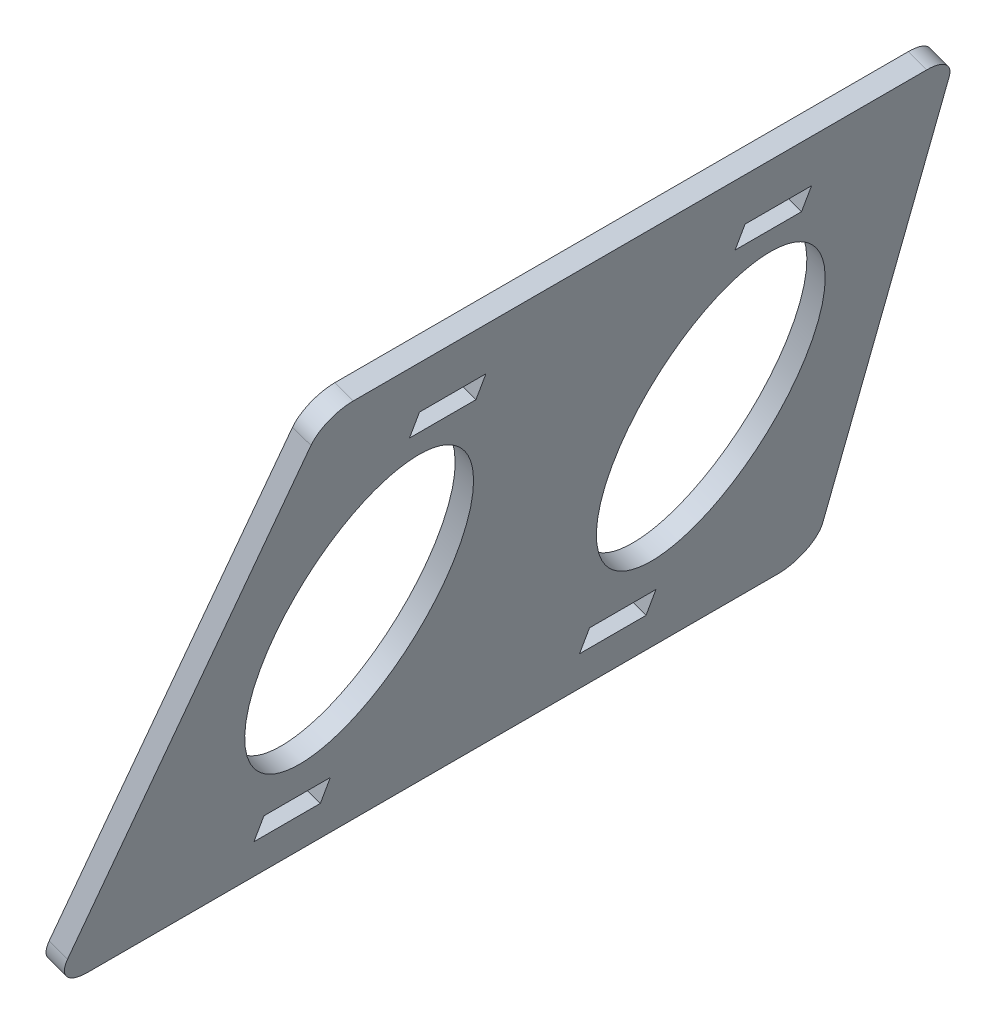
ISO-10303-21;
HEADER;
FILE_DESCRIPTION(('STEP AP214'),'2;1');
FILE_NAME('part.step','',(''),(''),'','','');
FILE_SCHEMA(('AUTOMOTIVE_DESIGN { 1 0 10303 214 1 1 1 1 }'));
ENDSEC;
DATA;
#1=APPLICATION_CONTEXT('core data for automotive mechanical design processes');
#2=APPLICATION_PROTOCOL_DEFINITION('international standard','automotive_design',2000,#1);
#3=PRODUCT_CONTEXT('',#1,'mechanical');
#4=PRODUCT('Part','Part','',(#3));
#5=PRODUCT_RELATED_PRODUCT_CATEGORY('part','',(#4));
#6=PRODUCT_DEFINITION_FORMATION('','',#4);
#7=PRODUCT_DEFINITION_CONTEXT('part definition',#1,'design');
#8=PRODUCT_DEFINITION('design','',#6,#7);
#9=PRODUCT_DEFINITION_SHAPE('','',#8);
#10=(LENGTH_UNIT() NAMED_UNIT(*) SI_UNIT(.MILLI.,.METRE.));
#11=(NAMED_UNIT(*) PLANE_ANGLE_UNIT() SI_UNIT($,.RADIAN.));
#12=(NAMED_UNIT(*) SI_UNIT($,.STERADIAN.) SOLID_ANGLE_UNIT());
#13=UNCERTAINTY_MEASURE_WITH_UNIT(LENGTH_MEASURE(1.E-05),#10,'distance_accuracy_value','');
#14=(GEOMETRIC_REPRESENTATION_CONTEXT(3) GLOBAL_UNCERTAINTY_ASSIGNED_CONTEXT((#13)) GLOBAL_UNIT_ASSIGNED_CONTEXT((#10,
#11,#12)) REPRESENTATION_CONTEXT('',''));
#15=CARTESIAN_POINT('',(0.,0.,0.));
#16=DIRECTION('',(0.,0.,1.));
#17=DIRECTION('',(1.,0.,0.));
#18=AXIS2_PLACEMENT_3D('',#15,#16,#17);
#19=CARTESIAN_POINT('',(-40.2709018610442,206.838861365217,-44.0289294402157));
#20=DIRECTION('',(-0.93969262078591,0.342020143325665,0.));
#21=DIRECTION('',(-0.342020143325665,-0.93969262078591,0.));
#22=AXIS2_PLACEMENT_3D('',#19,#20,#21);
#23=CYLINDRICAL_SURFACE('',#22,5.);
#24=CARTESIAN_POINT('',(-68.3692794960448,217.065834455528,-44.0289294402157));
#25=DIRECTION('',(-0.939692620785913,0.342020143325656,0.));
#26=DIRECTION('',(-0.342020143325656,-0.939692620785913,0.));
#27=AXIS2_PLACEMENT_3D('',#24,#25,#26);
#28=CIRCLE('',#27,5.);
#29=CARTESIAN_POINT('',(-68.1855865013136,217.570526810664,-49.));
#30=VERTEX_POINT('',#29);
#31=CARTESIAN_POINT('',(-66.6591787794165,221.764297559458,-44.0289294402157));
#32=VERTEX_POINT('',#31);
#33=EDGE_CURVE('E320',#30,#32,#28,.F.);
#34=ORIENTED_EDGE('',*,*,#33,.F.);
#35=DIRECTION('',(-0.93969262078591,0.342020143325665,0.));
#36=VECTOR('',#35,1.);
#37=CARTESIAN_POINT('',(-40.087208866313,207.343553720353,-49.));
#38=LINE('',#37,#36);
#39=CARTESIAN_POINT('',(-71.0046643636713,218.596587240641,-49.));
#40=VERTEX_POINT('',#39);
#41=EDGE_CURVE('E364',#30,#40,#38,.T.);
#42=ORIENTED_EDGE('',*,*,#41,.T.);
#43=CARTESIAN_POINT('',(-71.1883573584025,218.091894885505,-44.0289294402157));
#44=DIRECTION('',(-0.93969262078591,0.342020143325665,0.));
#45=DIRECTION('',(-0.342020143325665,-0.93969262078591,0.));
#46=AXIS2_PLACEMENT_3D('',#43,#44,#45);
#47=CIRCLE('',#46,5.);
#48=CARTESIAN_POINT('',(-69.4782566417742,222.790357989435,-44.0289294402157));
#49=VERTEX_POINT('',#48);
#50=EDGE_CURVE('E337',#49,#40,#47,.T.);
#51=ORIENTED_EDGE('',*,*,#50,.F.);
#52=DIRECTION('',(-0.93969262078591,0.342020143325665,0.));
#53=VECTOR('',#52,1.);
#54=CARTESIAN_POINT('',(-38.5608011444158,211.537324469147,-44.0289294402157));
#55=LINE('',#54,#53);
#56=EDGE_CURVE('E367',#32,#49,#55,.T.);
#57=ORIENTED_EDGE('',*,*,#56,.F.);
#58=EDGE_LOOP('',(#34,#42,#51,#57));
#59=FACE_BOUND('',#58,.T.);
#60=ADVANCED_FACE('F31',(#59),#23,.T.);
#61=CARTESIAN_POINT('',(-40.087208866313,207.343553720353,-49.));
#62=DIRECTION('',(0.0367385989462375,0.100938471027188,-0.994214111956857));
#63=DIRECTION('',(0.,0.994885749576172,0.101006659633206));
#64=AXIS2_PLACEMENT_3D('',#61,#62,#63);
#65=PLANE('',#64);
#66=DIRECTION('',(0.340041253067873,0.934255664487078,0.107416477254837));
#67=VECTOR('',#66,1.);
#68=CARTESIAN_POINT('',(-68.1855865013137,217.570526810664,-49.));
#69=LINE('',#68,#67);
#70=CARTESIAN_POINT('',(-96.584712524337,139.544569330158,-57.9710705597843));
#71=VERTEX_POINT('',#70);
#72=EDGE_CURVE('E322',#71,#30,#69,.T.);
#73=ORIENTED_EDGE('',*,*,#72,.F.);
#74=DIRECTION('',(-0.93969262078591,0.342020143325665,0.));
#75=VECTOR('',#74,1.);
#76=CARTESIAN_POINT('',(-68.4863348893373,129.317596239847,-57.9710705597843));
#77=LINE('',#76,#75);
#78=CARTESIAN_POINT('',(-99.4037903866956,140.570629760135,-57.9710705597843));
#79=VERTEX_POINT('',#78);
#80=EDGE_CURVE('E361',#71,#79,#77,.T.);
#81=ORIENTED_EDGE('',*,*,#80,.T.);
#82=DIRECTION('',(-0.340041253067883,-0.934255664487074,-0.107416477254837));
#83=VECTOR('',#82,1.);
#84=CARTESIAN_POINT('',(-71.0046643636713,218.596587240641,-49.));
#85=LINE('',#84,#83);
#86=EDGE_CURVE('E339',#40,#79,#85,.T.);
#87=ORIENTED_EDGE('',*,*,#86,.F.);
#88=ORIENTED_EDGE('',*,*,#41,.F.);
#89=EDGE_LOOP('',(#73,#81,#87,#88));
#90=FACE_BOUND('',#89,.T.);
#91=ADVANCED_FACE('F389',(#90),#65,.T.);
#92=CARTESIAN_POINT('',(-68.6700278840684,128.812903884711,-53.));
#93=DIRECTION('',(-0.93969262078591,0.342020143325665,0.));
#94=DIRECTION('',(-0.342020143325665,-0.93969262078591,0.));
#95=AXIS2_PLACEMENT_3D('',#92,#93,#94);
#96=CYLINDRICAL_SURFACE('',#95,5.);
#97=ORIENTED_EDGE('',*,*,#80,.F.);
#98=CARTESIAN_POINT('',(-96.7684055190682,139.039876975022,-53.));
#99=DIRECTION('',(-0.939692620785913,0.342020143325656,0.));
#100=DIRECTION('',(-0.342020143325656,-0.939692620785913,0.));
#101=AXIS2_PLACEMENT_3D('',#98,#99,#100);
#102=CIRCLE('',#101,5.);
#103=CARTESIAN_POINT('',(-98.4785062356965,134.341413871092,-53.));
#104=VERTEX_POINT('',#103);
#105=EDGE_CURVE('E324',#104,#71,#102,.F.);
#106=ORIENTED_EDGE('',*,*,#105,.F.);
#107=DIRECTION('',(-0.93969262078591,0.342020143325665,0.));
#108=VECTOR('',#107,1.);
#109=CARTESIAN_POINT('',(-70.3801286006968,124.114440780781,-53.));
#110=LINE('',#109,#108);
#111=CARTESIAN_POINT('',(-101.297584098055,135.36747430107,-53.));
#112=VERTEX_POINT('',#111);
#113=EDGE_CURVE('E358',#104,#112,#110,.T.);
#114=ORIENTED_EDGE('',*,*,#113,.T.);
#115=CARTESIAN_POINT('',(-99.5874833814268,140.065937404999,-53.));
#116=DIRECTION('',(-0.93969262078591,0.342020143325665,0.));
#117=DIRECTION('',(-0.342020143325665,-0.93969262078591,0.));
#118=AXIS2_PLACEMENT_3D('',#115,#116,#117);
#119=CIRCLE('',#118,5.);
#120=EDGE_CURVE('E341',#79,#112,#119,.T.);
#121=ORIENTED_EDGE('',*,*,#120,.F.);
#122=EDGE_LOOP('',(#97,#106,#114,#121));
#123=FACE_BOUND('',#122,.T.);
#124=ADVANCED_FACE('F399',(#123),#96,.T.);
#125=CARTESIAN_POINT('',(-66.6591787794165,221.764297559458,58.));
#126=DIRECTION('',(-0.342020143325658,-0.939692620785912,0.));
#127=DIRECTION('',(0.939692620785912,-0.342020143325658,0.));
#128=AXIS2_PLACEMENT_3D('',#125,#126,#127);
#129=PLANE('',#128);
#130=DIRECTION('',(-0.93969262078591,0.342020143325665,0.));
#131=VECTOR('',#130,1.);
#132=CARTESIAN_POINT('',(-38.5608011444158,211.537324469147,44.0289294402157));
#133=LINE('',#132,#131);
#134=CARTESIAN_POINT('',(-66.6591787794165,221.764297559458,44.0289294402157));
#135=VERTEX_POINT('',#134);
#136=CARTESIAN_POINT('',(-69.4782566417742,222.790357989435,44.0289294402157));
#137=VERTEX_POINT('',#136);
#138=EDGE_CURVE('E348',#135,#137,#133,.T.);
#139=ORIENTED_EDGE('',*,*,#138,.F.);
#140=DIRECTION('',(0.,0.,-1.));
#141=VECTOR('',#140,1.);
#142=CARTESIAN_POINT('',(-66.6591787794165,221.764297559458,58.));
#143=LINE('',#142,#141);
#144=EDGE_CURVE('E11',#135,#32,#143,.T.);
#145=ORIENTED_EDGE('',*,*,#144,.T.);
#146=ORIENTED_EDGE('',*,*,#56,.T.);
#147=DIRECTION('',(0.,0.,-1.));
#148=VECTOR('',#147,1.);
#149=CARTESIAN_POINT('',(-69.4782566417742,222.790357989435,58.));
#150=LINE('',#149,#148);
#151=EDGE_CURVE('E39',#137,#49,#150,.T.);
#152=ORIENTED_EDGE('',*,*,#151,.F.);
#153=EDGE_LOOP('',(#139,#145,#146,#152));
#154=FACE_BOUND('',#153,.T.);
#155=ADVANCED_FACE('F411',(#154),#129,.F.);
#156=CARTESIAN_POINT('',(-98.4785062356965,134.341413871092,58.));
#157=DIRECTION('',(0.342020143325656,0.939692620785913,0.));
#158=DIRECTION('',(-0.939692620785913,0.342020143325656,0.));
#159=AXIS2_PLACEMENT_3D('',#156,#157,#158);
#160=PLANE('',#159);
#161=DIRECTION('',(0.,0.,-1.));
#162=VECTOR('',#161,1.);
#163=CARTESIAN_POINT('',(-98.4785062356965,134.341413871092,58.));
#164=LINE('',#163,#162);
#165=CARTESIAN_POINT('',(-98.4785062356965,134.341413871092,53.));
#166=VERTEX_POINT('',#165);
#167=EDGE_CURVE('E351',#166,#104,#164,.T.);
#168=ORIENTED_EDGE('',*,*,#167,.F.);
#169=DIRECTION('',(-0.93969262078591,0.342020143325665,0.));
#170=VECTOR('',#169,1.);
#171=CARTESIAN_POINT('',(-70.3801286006968,124.114440780781,53.));
#172=LINE('',#171,#170);
#173=CARTESIAN_POINT('',(-101.297584098055,135.367474301069,53.));
#174=VERTEX_POINT('',#173);
#175=EDGE_CURVE('E355',#166,#174,#172,.T.);
#176=ORIENTED_EDGE('',*,*,#175,.T.);
#177=DIRECTION('',(0.,0.,-1.));
#178=VECTOR('',#177,1.);
#179=CARTESIAN_POINT('',(-101.297584098055,135.367474301069,58.));
#180=LINE('',#179,#178);
#181=EDGE_CURVE('E372',#174,#112,#180,.T.);
#182=ORIENTED_EDGE('',*,*,#181,.T.);
#183=ORIENTED_EDGE('',*,*,#113,.F.);
#184=EDGE_LOOP('',(#168,#176,#182,#183));
#185=FACE_BOUND('',#184,.T.);
#186=ADVANCED_FACE('F396',(#185),#160,.F.);
#187=CARTESIAN_POINT('',(-66.6591787794165,221.764297559458,58.));
#188=DIRECTION('',(-0.939692620785913,0.342020143325656,0.));
#189=DIRECTION('',(-0.342020143325656,-0.939692620785913,0.));
#190=AXIS2_PLACEMENT_3D('',#187,#188,#189);
#191=PLANE('',#190);
#192=CARTESIAN_POINT('',(-82.7870055468363,177.453457691096,27.));
#193=DIRECTION('',(-0.93969262078591,0.342020143325665,0.));
#194=DIRECTION('',(-0.342020143325665,-0.93969262078591,0.));
#195=AXIS2_PLACEMENT_3D('',#192,#193,#194);
#196=ELLIPSE('',#195,26.7782561446256,15.);
#197=CARTESIAN_POINT('',(-91.9457085514325,152.290127994476,27.));
#198=VERTEX_POINT('',#197);
#199=EDGE_CURVE('E662',#198,#198,#196,.F.);
#200=ORIENTED_EDGE('',*,*,#199,.F.);
#201=EDGE_LOOP('',(#200));
#202=FACE_BOUND('',#201,.T.);
#203=CARTESIAN_POINT('',(-82.7870055468363,177.453457691096,-27.));
#204=DIRECTION('',(-0.93969262078591,0.342020143325665,0.));
#205=DIRECTION('',(-0.342020143325665,-0.93969262078591,0.));
#206=AXIS2_PLACEMENT_3D('',#203,#204,#205);
#207=ELLIPSE('',#206,26.7782561446256,15.);
#208=CARTESIAN_POINT('',(-91.9457085514325,152.290127994476,-27.));
#209=VERTEX_POINT('',#208);
#210=EDGE_CURVE('E667',#209,#209,#207,.F.);
#211=ORIENTED_EDGE('',*,*,#210,.F.);
#212=EDGE_LOOP('',(#211));
#213=FACE_BOUND('',#212,.T.);
#214=DIRECTION('',(-0.342020143325656,-0.939692620785913,0.));
#215=VECTOR('',#214,1.);
#216=CARTESIAN_POINT('',(-94.3056475403789,145.806248911053,30.1));
#217=LINE('',#216,#215);
#218=CARTESIAN_POINT('',(-94.3056475403788,145.806248911053,30.1));
#219=VERTEX_POINT('',#218);
#220=CARTESIAN_POINT('',(-95.8394177269125,141.592249956919,30.1));
#221=VERTEX_POINT('',#220);
#222=EDGE_CURVE('E211',#219,#221,#217,.T.);
#223=ORIENTED_EDGE('',*,*,#222,.F.);
#224=DIRECTION('',(0.,0.,1.));
#225=VECTOR('',#224,1.);
#226=CARTESIAN_POINT('',(-94.3056475403788,145.806248911053,30.1));
#227=LINE('',#226,#225);
#228=CARTESIAN_POINT('',(-94.3056475403788,145.806248911053,19.9));
#229=VERTEX_POINT('',#228);
#230=EDGE_CURVE('E194',#229,#219,#227,.T.);
#231=ORIENTED_EDGE('',*,*,#230,.F.);
#232=DIRECTION('',(0.342020143325656,0.939692620785913,0.));
#233=VECTOR('',#232,1.);
#234=CARTESIAN_POINT('',(-94.3056475403789,145.806248911053,19.9));
#235=LINE('',#234,#233);
#236=CARTESIAN_POINT('',(-95.8394177269125,141.592249956919,19.9));
#237=VERTEX_POINT('',#236);
#238=EDGE_CURVE('E203',#237,#229,#235,.T.);
#239=ORIENTED_EDGE('',*,*,#238,.F.);
#240=DIRECTION('',(0.,0.,-1.));
#241=VECTOR('',#240,1.);
#242=CARTESIAN_POINT('',(-95.8394177269125,141.592249956919,30.1));
#243=LINE('',#242,#241);
#244=EDGE_CURVE('E46',#221,#237,#243,.T.);
#245=ORIENTED_EDGE('',*,*,#244,.F.);
#246=EDGE_LOOP('',(#223,#231,#239,#245));
#247=FACE_BOUND('',#246,.T.);
#248=DIRECTION('',(-0.342020143325656,-0.939692620785913,0.));
#249=VECTOR('',#248,1.);
#250=CARTESIAN_POINT('',(-70.4186336534106,211.4352801837,30.1));
#251=LINE('',#250,#249);
#252=CARTESIAN_POINT('',(-70.4186336534105,211.4352801837,30.1));
#253=VERTEX_POINT('',#252);
#254=CARTESIAN_POINT('',(-71.9524038399441,207.221281229566,30.1));
#255=VERTEX_POINT('',#254);
#256=EDGE_CURVE('E229',#253,#255,#251,.T.);
#257=ORIENTED_EDGE('',*,*,#256,.F.);
#258=DIRECTION('',(0.,0.,1.));
#259=VECTOR('',#258,1.);
#260=CARTESIAN_POINT('',(-70.4186336534105,211.4352801837,30.1));
#261=LINE('',#260,#259);
#262=CARTESIAN_POINT('',(-70.4186336534105,211.4352801837,19.9));
#263=VERTEX_POINT('',#262);
#264=EDGE_CURVE('E232',#263,#253,#261,.T.);
#265=ORIENTED_EDGE('',*,*,#264,.F.);
#266=DIRECTION('',(0.342020143325656,0.939692620785913,0.));
#267=VECTOR('',#266,1.);
#268=CARTESIAN_POINT('',(-70.4186336534106,211.4352801837,19.9));
#269=LINE('',#268,#267);
#270=CARTESIAN_POINT('',(-71.9524038399442,207.221281229566,19.9));
#271=VERTEX_POINT('',#270);
#272=EDGE_CURVE('E249',#271,#263,#269,.T.);
#273=ORIENTED_EDGE('',*,*,#272,.F.);
#274=DIRECTION('',(0.,0.,-1.));
#275=VECTOR('',#274,1.);
#276=CARTESIAN_POINT('',(-71.9524038399442,207.221281229566,30.1));
#277=LINE('',#276,#275);
#278=EDGE_CURVE('E206',#255,#271,#277,.T.);
#279=ORIENTED_EDGE('',*,*,#278,.F.);
#280=EDGE_LOOP('',(#257,#265,#273,#279));
#281=FACE_BOUND('',#280,.T.);
#282=DIRECTION('',(0.,0.,1.));
#283=VECTOR('',#282,1.);
#284=CARTESIAN_POINT('',(-94.3056475403788,145.806248911053,-30.1));
#285=LINE('',#284,#283);
#286=CARTESIAN_POINT('',(-94.3056475403788,145.806248911053,-30.1));
#287=VERTEX_POINT('',#286);
#288=CARTESIAN_POINT('',(-94.3056475403788,145.806248911053,-19.9));
#289=VERTEX_POINT('',#288);
#290=EDGE_CURVE('E260',#287,#289,#285,.T.);
#291=ORIENTED_EDGE('',*,*,#290,.F.);
#292=DIRECTION('',(0.342020143325656,0.939692620785913,0.));
#293=VECTOR('',#292,1.);
#294=CARTESIAN_POINT('',(-94.3056475403789,145.806248911053,-30.1));
#295=LINE('',#294,#293);
#296=CARTESIAN_POINT('',(-95.8394177269125,141.592249956919,-30.1));
#297=VERTEX_POINT('',#296);
#298=EDGE_CURVE('E263',#297,#287,#295,.T.);
#299=ORIENTED_EDGE('',*,*,#298,.F.);
#300=DIRECTION('',(0.,0.,-1.));
#301=VECTOR('',#300,1.);
#302=CARTESIAN_POINT('',(-95.8394177269125,141.592249956919,-30.1));
#303=LINE('',#302,#301);
#304=CARTESIAN_POINT('',(-95.8394177269125,141.592249956919,-19.9));
#305=VERTEX_POINT('',#304);
#306=EDGE_CURVE('E280',#305,#297,#303,.T.);
#307=ORIENTED_EDGE('',*,*,#306,.F.);
#308=DIRECTION('',(-0.342020143325656,-0.939692620785913,0.));
#309=VECTOR('',#308,1.);
#310=CARTESIAN_POINT('',(-94.3056475403789,145.806248911053,-19.9));
#311=LINE('',#310,#309);
#312=EDGE_CURVE('E258',#289,#305,#311,.T.);
#313=ORIENTED_EDGE('',*,*,#312,.F.);
#314=EDGE_LOOP('',(#291,#299,#307,#313));
#315=FACE_BOUND('',#314,.T.);
#316=DIRECTION('',(0.,0.,1.));
#317=VECTOR('',#316,1.);
#318=CARTESIAN_POINT('',(-70.4186336534105,211.4352801837,-30.1));
#319=LINE('',#318,#317);
#320=CARTESIAN_POINT('',(-70.4186336534105,211.4352801837,-30.1));
#321=VERTEX_POINT('',#320);
#322=CARTESIAN_POINT('',(-70.4186336534105,211.4352801837,-19.9));
#323=VERTEX_POINT('',#322);
#324=EDGE_CURVE('E291',#321,#323,#319,.T.);
#325=ORIENTED_EDGE('',*,*,#324,.F.);
#326=DIRECTION('',(0.342020143325656,0.939692620785913,0.));
#327=VECTOR('',#326,1.);
#328=CARTESIAN_POINT('',(-70.4186336534106,211.4352801837,-30.1));
#329=LINE('',#328,#327);
#330=CARTESIAN_POINT('',(-71.9524038399442,207.221281229566,-30.1));
#331=VERTEX_POINT('',#330);
#332=EDGE_CURVE('E294',#331,#321,#329,.T.);
#333=ORIENTED_EDGE('',*,*,#332,.F.);
#334=DIRECTION('',(0.,0.,-1.));
#335=VECTOR('',#334,1.);
#336=CARTESIAN_POINT('',(-71.9524038399442,207.221281229566,-30.1));
#337=LINE('',#336,#335);
#338=CARTESIAN_POINT('',(-71.9524038399441,207.221281229566,-19.9));
#339=VERTEX_POINT('',#338);
#340=EDGE_CURVE('E311',#339,#331,#337,.T.);
#341=ORIENTED_EDGE('',*,*,#340,.F.);
#342=DIRECTION('',(-0.342020143325656,-0.939692620785913,0.));
#343=VECTOR('',#342,1.);
#344=CARTESIAN_POINT('',(-70.4186336534106,211.4352801837,-19.9));
#345=LINE('',#344,#343);
#346=EDGE_CURVE('E289',#323,#339,#345,.T.);
#347=ORIENTED_EDGE('',*,*,#346,.F.);
#348=EDGE_LOOP('',(#325,#333,#341,#347));
#349=FACE_BOUND('',#348,.T.);
#350=CARTESIAN_POINT('',(-68.3692794960448,217.065834455528,44.0289294402157));
#351=DIRECTION('',(-0.939692620785913,0.342020143325656,0.));
#352=DIRECTION('',(-0.342020143325656,-0.939692620785913,0.));
#353=AXIS2_PLACEMENT_3D('',#350,#351,#352);
#354=CIRCLE('',#353,5.);
#355=CARTESIAN_POINT('',(-68.1855865013135,217.570526810664,49.));
#356=VERTEX_POINT('',#355);
#357=EDGE_CURVE('E331',#135,#356,#354,.F.);
#358=ORIENTED_EDGE('',*,*,#357,.T.);
#359=DIRECTION('',(-0.340041253067873,-0.934255664487078,0.107416477254837));
#360=VECTOR('',#359,1.);
#361=CARTESIAN_POINT('',(-96.5847125243371,139.544569330157,57.9710705597843));
#362=LINE('',#361,#360);
#363=CARTESIAN_POINT('',(-96.584712524337,139.544569330158,57.9710705597843));
#364=VERTEX_POINT('',#363);
#365=EDGE_CURVE('E328',#356,#364,#362,.T.);
#366=ORIENTED_EDGE('',*,*,#365,.T.);
#367=CARTESIAN_POINT('',(-96.7684055190682,139.039876975022,53.));
#368=DIRECTION('',(-0.939692620785913,0.342020143325656,0.));
#369=DIRECTION('',(-0.342020143325656,-0.939692620785913,0.));
#370=AXIS2_PLACEMENT_3D('',#367,#368,#369);
#371=CIRCLE('',#370,4.99999999999998);
#372=EDGE_CURVE('E326',#364,#166,#371,.F.);
#373=ORIENTED_EDGE('',*,*,#372,.T.);
#374=ORIENTED_EDGE('',*,*,#167,.T.);
#375=ORIENTED_EDGE('',*,*,#105,.T.);
#376=ORIENTED_EDGE('',*,*,#72,.T.);
#377=ORIENTED_EDGE('',*,*,#33,.T.);
#378=ORIENTED_EDGE('',*,*,#144,.F.);
#379=EDGE_LOOP('',(#358,#366,#373,#374,#375,#376,#377,#378));
#380=FACE_BOUND('',#379,.T.);
#381=ADVANCED_FACE('F33',(#202,#213,#247,#281,#315,#349,#380),#191,.F.);
#382=CARTESIAN_POINT('',(-69.4782566417742,222.790357989435,58.));
#383=DIRECTION('',(0.93969262078591,-0.342020143325665,0.));
#384=DIRECTION('',(0.342020143325665,0.93969262078591,0.));
#385=AXIS2_PLACEMENT_3D('',#382,#383,#384);
#386=PLANE('',#385);
#387=CARTESIAN_POINT('',(-85.606083409194,178.479518121073,27.));
#388=DIRECTION('',(-0.93969262078591,0.342020143325665,0.));
#389=DIRECTION('',(-0.342020143325665,-0.93969262078591,0.));
#390=AXIS2_PLACEMENT_3D('',#387,#388,#389);
#391=ELLIPSE('',#390,26.7782561446256,15.);
#392=CARTESIAN_POINT('',(-94.7647864137902,153.316188424453,27.));
#393=VERTEX_POINT('',#392);
#394=EDGE_CURVE('E439',#393,#393,#391,.T.);
#395=ORIENTED_EDGE('',*,*,#394,.F.);
#396=EDGE_LOOP('',(#395));
#397=FACE_BOUND('',#396,.T.);
#398=CARTESIAN_POINT('',(-85.606083409194,178.479518121073,-27.));
#399=DIRECTION('',(-0.93969262078591,0.342020143325665,0.));
#400=DIRECTION('',(-0.342020143325665,-0.93969262078591,0.));
#401=AXIS2_PLACEMENT_3D('',#398,#399,#400);
#402=ELLIPSE('',#401,26.7782561446256,15.);
#403=CARTESIAN_POINT('',(-94.7647864137902,153.316188424453,-27.));
#404=VERTEX_POINT('',#403);
#405=EDGE_CURVE('E443',#404,#404,#402,.T.);
#406=ORIENTED_EDGE('',*,*,#405,.F.);
#407=EDGE_LOOP('',(#406));
#408=FACE_BOUND('',#407,.T.);
#409=DIRECTION('',(-0.342020143325667,-0.939692620785909,0.));
#410=VECTOR('',#409,1.);
#411=CARTESIAN_POINT('',(-97.1247254027373,146.83230934103,19.9));
#412=LINE('',#411,#410);
#413=CARTESIAN_POINT('',(-97.1247254027373,146.83230934103,19.9));
#414=VERTEX_POINT('',#413);
#415=CARTESIAN_POINT('',(-98.658495589271,142.618310386896,19.9));
#416=VERTEX_POINT('',#415);
#417=EDGE_CURVE('E213',#414,#416,#412,.T.);
#418=ORIENTED_EDGE('',*,*,#417,.F.);
#419=DIRECTION('',(0.,0.,-1.));
#420=VECTOR('',#419,1.);
#421=CARTESIAN_POINT('',(-97.1247254027373,146.83230934103,30.1));
#422=LINE('',#421,#420);
#423=CARTESIAN_POINT('',(-97.1247254027373,146.83230934103,30.1));
#424=VERTEX_POINT('',#423);
#425=EDGE_CURVE('E54',#424,#414,#422,.T.);
#426=ORIENTED_EDGE('',*,*,#425,.F.);
#427=DIRECTION('',(0.342020143325667,0.939692620785909,0.));
#428=VECTOR('',#427,1.);
#429=CARTESIAN_POINT('',(-97.1247254027373,146.83230934103,30.1));
#430=LINE('',#429,#428);
#431=CARTESIAN_POINT('',(-98.658495589271,142.618310386896,30.1));
#432=VERTEX_POINT('',#431);
#433=EDGE_CURVE('E200',#432,#424,#430,.T.);
#434=ORIENTED_EDGE('',*,*,#433,.F.);
#435=DIRECTION('',(0.,0.,1.));
#436=VECTOR('',#435,1.);
#437=CARTESIAN_POINT('',(-98.658495589271,142.618310386896,30.1));
#438=LINE('',#437,#436);
#439=EDGE_CURVE('E219',#416,#432,#438,.T.);
#440=ORIENTED_EDGE('',*,*,#439,.F.);
#441=EDGE_LOOP('',(#418,#426,#434,#440));
#442=FACE_BOUND('',#441,.T.);
#443=DIRECTION('',(-0.342020143325665,-0.93969262078591,0.));
#444=VECTOR('',#443,1.);
#445=CARTESIAN_POINT('',(-73.2377115157683,212.461340613677,19.9));
#446=LINE('',#445,#444);
#447=CARTESIAN_POINT('',(-73.2377115157683,212.461340613677,19.9));
#448=VERTEX_POINT('',#447);
#449=CARTESIAN_POINT('',(-74.771481702302,208.247341659543,19.9));
#450=VERTEX_POINT('',#449);
#451=EDGE_CURVE('E237',#448,#450,#446,.T.);
#452=ORIENTED_EDGE('',*,*,#451,.F.);
#453=DIRECTION('',(0.,0.,-1.));
#454=VECTOR('',#453,1.);
#455=CARTESIAN_POINT('',(-73.2377115157683,212.461340613677,30.1));
#456=LINE('',#455,#454);
#457=CARTESIAN_POINT('',(-73.2377115157683,212.461340613677,30.1));
#458=VERTEX_POINT('',#457);
#459=EDGE_CURVE('E235',#458,#448,#456,.T.);
#460=ORIENTED_EDGE('',*,*,#459,.F.);
#461=DIRECTION('',(0.342020143325665,0.93969262078591,0.));
#462=VECTOR('',#461,1.);
#463=CARTESIAN_POINT('',(-73.2377115157683,212.461340613677,30.1));
#464=LINE('',#463,#462);
#465=CARTESIAN_POINT('',(-74.771481702302,208.247341659543,30.1));
#466=VERTEX_POINT('',#465);
#467=EDGE_CURVE('E243',#466,#458,#464,.T.);
#468=ORIENTED_EDGE('',*,*,#467,.F.);
#469=DIRECTION('',(0.,0.,1.));
#470=VECTOR('',#469,1.);
#471=CARTESIAN_POINT('',(-74.771481702302,208.247341659543,30.1));
#472=LINE('',#471,#470);
#473=EDGE_CURVE('E240',#450,#466,#472,.T.);
#474=ORIENTED_EDGE('',*,*,#473,.F.);
#475=EDGE_LOOP('',(#452,#460,#468,#474));
#476=FACE_BOUND('',#475,.T.);
#477=DIRECTION('',(0.,0.,1.));
#478=VECTOR('',#477,1.);
#479=CARTESIAN_POINT('',(-98.658495589271,142.618310386896,-30.1));
#480=LINE('',#479,#478);
#481=CARTESIAN_POINT('',(-98.658495589271,142.618310386896,-30.1));
#482=VERTEX_POINT('',#481);
#483=CARTESIAN_POINT('',(-98.658495589271,142.618310386896,-19.9));
#484=VERTEX_POINT('',#483);
#485=EDGE_CURVE('E268',#482,#484,#480,.T.);
#486=ORIENTED_EDGE('',*,*,#485,.F.);
#487=DIRECTION('',(-0.342020143325667,-0.939692620785909,0.));
#488=VECTOR('',#487,1.);
#489=CARTESIAN_POINT('',(-97.1247254027373,146.83230934103,-30.1));
#490=LINE('',#489,#488);
#491=CARTESIAN_POINT('',(-97.1247254027373,146.83230934103,-30.1));
#492=VERTEX_POINT('',#491);
#493=EDGE_CURVE('E266',#492,#482,#490,.T.);
#494=ORIENTED_EDGE('',*,*,#493,.F.);
#495=DIRECTION('',(0.,0.,-1.));
#496=VECTOR('',#495,1.);
#497=CARTESIAN_POINT('',(-97.1247254027373,146.83230934103,-30.1));
#498=LINE('',#497,#496);
#499=CARTESIAN_POINT('',(-97.1247254027373,146.83230934103,-19.9));
#500=VERTEX_POINT('',#499);
#501=EDGE_CURVE('E274',#500,#492,#498,.T.);
#502=ORIENTED_EDGE('',*,*,#501,.F.);
#503=DIRECTION('',(0.342020143325667,0.939692620785909,0.));
#504=VECTOR('',#503,1.);
#505=CARTESIAN_POINT('',(-97.1247254027373,146.83230934103,-19.9));
#506=LINE('',#505,#504);
#507=EDGE_CURVE('E271',#484,#500,#506,.T.);
#508=ORIENTED_EDGE('',*,*,#507,.F.);
#509=EDGE_LOOP('',(#486,#494,#502,#508));
#510=FACE_BOUND('',#509,.T.);
#511=DIRECTION('',(0.,0.,1.));
#512=VECTOR('',#511,1.);
#513=CARTESIAN_POINT('',(-74.771481702302,208.247341659543,-30.1));
#514=LINE('',#513,#512);
#515=CARTESIAN_POINT('',(-74.771481702302,208.247341659543,-30.1));
#516=VERTEX_POINT('',#515);
#517=CARTESIAN_POINT('',(-74.771481702302,208.247341659543,-19.9));
#518=VERTEX_POINT('',#517);
#519=EDGE_CURVE('E299',#516,#518,#514,.T.);
#520=ORIENTED_EDGE('',*,*,#519,.F.);
#521=DIRECTION('',(-0.342020143325667,-0.939692620785909,0.));
#522=VECTOR('',#521,1.);
#523=CARTESIAN_POINT('',(-73.2377115157683,212.461340613677,-30.1));
#524=LINE('',#523,#522);
#525=CARTESIAN_POINT('',(-73.2377115157683,212.461340613677,-30.1));
#526=VERTEX_POINT('',#525);
#527=EDGE_CURVE('E297',#526,#516,#524,.T.);
#528=ORIENTED_EDGE('',*,*,#527,.F.);
#529=DIRECTION('',(0.,0.,-1.));
#530=VECTOR('',#529,1.);
#531=CARTESIAN_POINT('',(-73.2377115157683,212.461340613677,-30.1));
#532=LINE('',#531,#530);
#533=CARTESIAN_POINT('',(-73.2377115157683,212.461340613677,-19.9));
#534=VERTEX_POINT('',#533);
#535=EDGE_CURVE('E305',#534,#526,#532,.T.);
#536=ORIENTED_EDGE('',*,*,#535,.F.);
#537=DIRECTION('',(0.342020143325667,0.939692620785909,0.));
#538=VECTOR('',#537,1.);
#539=CARTESIAN_POINT('',(-73.2377115157683,212.461340613677,-19.9));
#540=LINE('',#539,#538);
#541=EDGE_CURVE('E302',#518,#534,#540,.T.);
#542=ORIENTED_EDGE('',*,*,#541,.F.);
#543=EDGE_LOOP('',(#520,#528,#536,#542));
#544=FACE_BOUND('',#543,.T.);
#545=CARTESIAN_POINT('',(-71.1883573584025,218.091894885505,44.0289294402157));
#546=DIRECTION('',(-0.93969262078591,0.342020143325665,0.));
#547=DIRECTION('',(-0.342020143325665,-0.93969262078591,0.));
#548=AXIS2_PLACEMENT_3D('',#545,#546,#547);
#549=CIRCLE('',#548,5.);
#550=CARTESIAN_POINT('',(-71.0046643636713,218.596587240641,49.));
#551=VERTEX_POINT('',#550);
#552=EDGE_CURVE('E334',#551,#137,#549,.T.);
#553=ORIENTED_EDGE('',*,*,#552,.T.);
#554=ORIENTED_EDGE('',*,*,#151,.T.);
#555=ORIENTED_EDGE('',*,*,#50,.T.);
#556=ORIENTED_EDGE('',*,*,#86,.T.);
#557=ORIENTED_EDGE('',*,*,#120,.T.);
#558=ORIENTED_EDGE('',*,*,#181,.F.);
#559=CARTESIAN_POINT('',(-99.5874833814268,140.065937404999,53.));
#560=DIRECTION('',(-0.93969262078591,0.342020143325665,0.));
#561=DIRECTION('',(-0.342020143325665,-0.93969262078591,0.));
#562=AXIS2_PLACEMENT_3D('',#559,#560,#561);
#563=CIRCLE('',#562,4.99999999999998);
#564=CARTESIAN_POINT('',(-99.4037903866956,140.570629760135,57.9710705597843));
#565=VERTEX_POINT('',#564);
#566=EDGE_CURVE('E343',#174,#565,#563,.T.);
#567=ORIENTED_EDGE('',*,*,#566,.T.);
#568=DIRECTION('',(0.340041253067883,0.934255664487074,-0.107416477254837));
#569=VECTOR('',#568,1.);
#570=CARTESIAN_POINT('',(-99.4037903866956,140.570629760135,57.9710705597843));
#571=LINE('',#570,#569);
#572=EDGE_CURVE('E345',#565,#551,#571,.T.);
#573=ORIENTED_EDGE('',*,*,#572,.T.);
#574=EDGE_LOOP('',(#553,#554,#555,#556,#557,#558,#567,#573));
#575=FACE_BOUND('',#574,.T.);
#576=ADVANCED_FACE('F378',(#397,#408,#442,#476,#510,#544,#575),#386,.F.);
#577=CARTESIAN_POINT('',(-68.6700278840684,128.812903884711,53.));
#578=DIRECTION('',(-0.93969262078591,0.342020143325665,0.));
#579=DIRECTION('',(-0.342020143325665,-0.93969262078591,0.));
#580=AXIS2_PLACEMENT_3D('',#577,#578,#579);
#581=CYLINDRICAL_SURFACE('',#580,4.99999999999998);
#582=ORIENTED_EDGE('',*,*,#175,.F.);
#583=ORIENTED_EDGE('',*,*,#372,.F.);
#584=DIRECTION('',(-0.93969262078591,0.342020143325665,0.));
#585=VECTOR('',#584,1.);
#586=CARTESIAN_POINT('',(-68.4863348893373,129.317596239847,57.9710705597843));
#587=LINE('',#586,#585);
#588=EDGE_CURVE('E352',#364,#565,#587,.T.);
#589=ORIENTED_EDGE('',*,*,#588,.T.);
#590=ORIENTED_EDGE('',*,*,#566,.F.);
#591=EDGE_LOOP('',(#582,#583,#589,#590));
#592=FACE_BOUND('',#591,.T.);
#593=ADVANCED_FACE('F403',(#592),#581,.T.);
#594=CARTESIAN_POINT('',(-40.2709018610442,206.838861365217,44.0289294402157));
#595=DIRECTION('',(-0.93969262078591,0.342020143325665,0.));
#596=DIRECTION('',(-0.342020143325665,-0.93969262078591,0.));
#597=AXIS2_PLACEMENT_3D('',#594,#595,#596);
#598=CYLINDRICAL_SURFACE('',#597,5.);
#599=ORIENTED_EDGE('',*,*,#357,.F.);
#600=ORIENTED_EDGE('',*,*,#138,.T.);
#601=ORIENTED_EDGE('',*,*,#552,.F.);
#602=DIRECTION('',(-0.93969262078591,0.342020143325665,0.));
#603=VECTOR('',#602,1.);
#604=CARTESIAN_POINT('',(-40.087208866313,207.343553720353,49.));
#605=LINE('',#604,#603);
#606=EDGE_CURVE('E349',#356,#551,#605,.T.);
#607=ORIENTED_EDGE('',*,*,#606,.F.);
#608=EDGE_LOOP('',(#599,#600,#601,#607));
#609=FACE_BOUND('',#608,.T.);
#610=ADVANCED_FACE('F409',(#609),#598,.T.);
#611=CARTESIAN_POINT('',(-68.4863348893373,129.317596239847,57.9710705597843));
#612=DIRECTION('',(0.0367385989462374,0.100938471027188,0.994214111956857));
#613=DIRECTION('',(0.,-0.994885749576172,0.101006659633206));
#614=AXIS2_PLACEMENT_3D('',#611,#612,#613);
#615=PLANE('',#614);
#616=ORIENTED_EDGE('',*,*,#365,.F.);
#617=ORIENTED_EDGE('',*,*,#606,.T.);
#618=ORIENTED_EDGE('',*,*,#572,.F.);
#619=ORIENTED_EDGE('',*,*,#588,.F.);
#620=EDGE_LOOP('',(#616,#617,#618,#619));
#621=FACE_BOUND('',#620,.T.);
#622=ADVANCED_FACE('F406',(#621),#615,.T.);
#623=CARTESIAN_POINT('',(-42.3202560184099,201.208307093389,-30.1));
#624=DIRECTION('',(0.,0.,-1.));
#625=DIRECTION('',(0.,1.,0.));
#626=AXIS2_PLACEMENT_3D('',#623,#624,#625);
#627=PLANE('',#626);
#628=ORIENTED_EDGE('',*,*,#332,.T.);
#629=DIRECTION('',(-0.93969262078591,0.342020143325665,0.));
#630=VECTOR('',#629,1.);
#631=CARTESIAN_POINT('',(-42.3202560184099,201.208307093389,-30.1));
#632=LINE('',#631,#630);
#633=EDGE_CURVE('E309',#321,#526,#632,.T.);
#634=ORIENTED_EDGE('',*,*,#633,.T.);
#635=ORIENTED_EDGE('',*,*,#527,.T.);
#636=DIRECTION('',(-0.93969262078591,0.342020143325665,0.));
#637=VECTOR('',#636,1.);
#638=CARTESIAN_POINT('',(-43.8540262049437,196.994308139255,-30.1));
#639=LINE('',#638,#637);
#640=EDGE_CURVE('E308',#331,#516,#639,.T.);
#641=ORIENTED_EDGE('',*,*,#640,.F.);
#642=EDGE_LOOP('',(#628,#634,#635,#641));
#643=FACE_BOUND('',#642,.T.);
#644=ADVANCED_FACE('F464',(#643),#627,.F.);
#645=CARTESIAN_POINT('',(-42.3202560184099,201.208307093389,-30.1));
#646=DIRECTION('',(0.342020143325665,0.93969262078591,0.));
#647=DIRECTION('',(-0.93969262078591,0.342020143325665,0.));
#648=AXIS2_PLACEMENT_3D('',#645,#646,#647);
#649=PLANE('',#648);
#650=ORIENTED_EDGE('',*,*,#324,.T.);
#651=DIRECTION('',(-0.93969262078591,0.342020143325665,0.));
#652=VECTOR('',#651,1.);
#653=CARTESIAN_POINT('',(-42.3202560184099,201.208307093389,-19.9));
#654=LINE('',#653,#652);
#655=EDGE_CURVE('E312',#323,#534,#654,.T.);
#656=ORIENTED_EDGE('',*,*,#655,.T.);
#657=ORIENTED_EDGE('',*,*,#535,.T.);
#658=ORIENTED_EDGE('',*,*,#633,.F.);
#659=EDGE_LOOP('',(#650,#656,#657,#658));
#660=FACE_BOUND('',#659,.T.);
#661=ADVANCED_FACE('F467',(#660),#649,.F.);
#662=CARTESIAN_POINT('',(-42.3202560184099,201.208307093389,-19.9));
#663=DIRECTION('',(0.,0.,1.));
#664=DIRECTION('',(0.,-1.,0.));
#665=AXIS2_PLACEMENT_3D('',#662,#663,#664);
#666=PLANE('',#665);
#667=ORIENTED_EDGE('',*,*,#346,.T.);
#668=DIRECTION('',(-0.93969262078591,0.342020143325665,0.));
#669=VECTOR('',#668,1.);
#670=CARTESIAN_POINT('',(-43.8540262049437,196.994308139255,-19.9));
#671=LINE('',#670,#669);
#672=EDGE_CURVE('E314',#339,#518,#671,.T.);
#673=ORIENTED_EDGE('',*,*,#672,.T.);
#674=ORIENTED_EDGE('',*,*,#541,.T.);
#675=ORIENTED_EDGE('',*,*,#655,.F.);
#676=EDGE_LOOP('',(#667,#673,#674,#675));
#677=FACE_BOUND('',#676,.T.);
#678=ADVANCED_FACE('F470',(#677),#666,.F.);
#679=CARTESIAN_POINT('',(-43.8540262049437,196.994308139255,-30.1));
#680=DIRECTION('',(-0.342020143325665,-0.93969262078591,0.));
#681=DIRECTION('',(0.93969262078591,-0.342020143325665,0.));
#682=AXIS2_PLACEMENT_3D('',#679,#680,#681);
#683=PLANE('',#682);
#684=ORIENTED_EDGE('',*,*,#340,.T.);
#685=ORIENTED_EDGE('',*,*,#640,.T.);
#686=ORIENTED_EDGE('',*,*,#519,.T.);
#687=ORIENTED_EDGE('',*,*,#672,.F.);
#688=EDGE_LOOP('',(#684,#685,#686,#687));
#689=FACE_BOUND('',#688,.T.);
#690=ADVANCED_FACE('F460',(#689),#683,.F.);
#691=CARTESIAN_POINT('',(-66.207269905379,135.579275820742,-30.1));
#692=DIRECTION('',(0.,0.,-1.));
#693=DIRECTION('',(-1.,0.,0.));
#694=AXIS2_PLACEMENT_3D('',#691,#692,#693);
#695=PLANE('',#694);
#696=ORIENTED_EDGE('',*,*,#298,.T.);
#697=DIRECTION('',(-0.93969262078591,0.342020143325665,0.));
#698=VECTOR('',#697,1.);
#699=CARTESIAN_POINT('',(-66.207269905379,135.579275820742,-30.1));
#700=LINE('',#699,#698);
#701=EDGE_CURVE('E278',#287,#492,#700,.T.);
#702=ORIENTED_EDGE('',*,*,#701,.T.);
#703=ORIENTED_EDGE('',*,*,#493,.T.);
#704=DIRECTION('',(-0.93969262078591,0.342020143325665,0.));
#705=VECTOR('',#704,1.);
#706=CARTESIAN_POINT('',(-67.7410400919127,131.365276866608,-30.1));
#707=LINE('',#706,#705);
#708=EDGE_CURVE('E277',#297,#482,#707,.T.);
#709=ORIENTED_EDGE('',*,*,#708,.F.);
#710=EDGE_LOOP('',(#696,#702,#703,#709));
#711=FACE_BOUND('',#710,.T.);
#712=ADVANCED_FACE('F478',(#711),#695,.F.);
#713=CARTESIAN_POINT('',(-66.207269905379,135.579275820742,-30.1));
#714=DIRECTION('',(0.342020143325665,0.93969262078591,0.));
#715=DIRECTION('',(-0.93969262078591,0.342020143325665,0.));
#716=AXIS2_PLACEMENT_3D('',#713,#714,#715);
#717=PLANE('',#716);
#718=ORIENTED_EDGE('',*,*,#290,.T.);
#719=DIRECTION('',(-0.93969262078591,0.342020143325665,0.));
#720=VECTOR('',#719,1.);
#721=CARTESIAN_POINT('',(-66.207269905379,135.579275820742,-19.9));
#722=LINE('',#721,#720);
#723=EDGE_CURVE('E281',#289,#500,#722,.T.);
#724=ORIENTED_EDGE('',*,*,#723,.T.);
#725=ORIENTED_EDGE('',*,*,#501,.T.);
#726=ORIENTED_EDGE('',*,*,#701,.F.);
#727=EDGE_LOOP('',(#718,#724,#725,#726));
#728=FACE_BOUND('',#727,.T.);
#729=ADVANCED_FACE('F517',(#728),#717,.F.);
#730=CARTESIAN_POINT('',(-66.207269905379,135.579275820742,-19.9));
#731=DIRECTION('',(0.,0.,1.));
#732=DIRECTION('',(1.,0.,0.));
#733=AXIS2_PLACEMENT_3D('',#730,#731,#732);
#734=PLANE('',#733);
#735=ORIENTED_EDGE('',*,*,#312,.T.);
#736=DIRECTION('',(-0.93969262078591,0.342020143325665,0.));
#737=VECTOR('',#736,1.);
#738=CARTESIAN_POINT('',(-67.7410400919127,131.365276866608,-19.9));
#739=LINE('',#738,#737);
#740=EDGE_CURVE('E283',#305,#484,#739,.T.);
#741=ORIENTED_EDGE('',*,*,#740,.T.);
#742=ORIENTED_EDGE('',*,*,#507,.T.);
#743=ORIENTED_EDGE('',*,*,#723,.F.);
#744=EDGE_LOOP('',(#735,#741,#742,#743));
#745=FACE_BOUND('',#744,.T.);
#746=ADVANCED_FACE('F526',(#745),#734,.F.);
#747=CARTESIAN_POINT('',(-67.7410400919127,131.365276866608,-30.1));
#748=DIRECTION('',(-0.342020143325665,-0.93969262078591,0.));
#749=DIRECTION('',(0.93969262078591,-0.342020143325665,0.));
#750=AXIS2_PLACEMENT_3D('',#747,#748,#749);
#751=PLANE('',#750);
#752=ORIENTED_EDGE('',*,*,#306,.T.);
#753=ORIENTED_EDGE('',*,*,#708,.T.);
#754=ORIENTED_EDGE('',*,*,#485,.T.);
#755=ORIENTED_EDGE('',*,*,#740,.F.);
#756=EDGE_LOOP('',(#752,#753,#754,#755));
#757=FACE_BOUND('',#756,.T.);
#758=ADVANCED_FACE('F536',(#757),#751,.F.);
#759=CARTESIAN_POINT('',(-42.3202560184099,201.208307093389,30.1));
#760=DIRECTION('',(0.342020143325665,0.93969262078591,0.));
#761=DIRECTION('',(-0.93969262078591,0.342020143325665,0.));
#762=AXIS2_PLACEMENT_3D('',#759,#760,#761);
#763=PLANE('',#762);
#764=ORIENTED_EDGE('',*,*,#264,.T.);
#765=DIRECTION('',(-0.93969262078591,0.342020143325665,0.));
#766=VECTOR('',#765,1.);
#767=CARTESIAN_POINT('',(-42.3202560184099,201.208307093389,30.1));
#768=LINE('',#767,#766);
#769=EDGE_CURVE('E247',#253,#458,#768,.T.);
#770=ORIENTED_EDGE('',*,*,#769,.T.);
#771=ORIENTED_EDGE('',*,*,#459,.T.);
#772=DIRECTION('',(-0.93969262078591,0.342020143325665,0.));
#773=VECTOR('',#772,1.);
#774=CARTESIAN_POINT('',(-42.3202560184099,201.208307093389,19.9));
#775=LINE('',#774,#773);
#776=EDGE_CURVE('E246',#263,#448,#775,.T.);
#777=ORIENTED_EDGE('',*,*,#776,.F.);
#778=EDGE_LOOP('',(#764,#770,#771,#777));
#779=FACE_BOUND('',#778,.T.);
#780=ADVANCED_FACE('F546',(#779),#763,.F.);
#781=CARTESIAN_POINT('',(-42.3202560184099,201.208307093389,30.1));
#782=DIRECTION('',(0.,0.,1.));
#783=DIRECTION('',(1.,0.,0.));
#784=AXIS2_PLACEMENT_3D('',#781,#782,#783);
#785=PLANE('',#784);
#786=ORIENTED_EDGE('',*,*,#256,.T.);
#787=DIRECTION('',(-0.93969262078591,0.342020143325665,0.));
#788=VECTOR('',#787,1.);
#789=CARTESIAN_POINT('',(-43.8540262049437,196.994308139255,30.1));
#790=LINE('',#789,#788);
#791=EDGE_CURVE('E250',#255,#466,#790,.T.);
#792=ORIENTED_EDGE('',*,*,#791,.T.);
#793=ORIENTED_EDGE('',*,*,#467,.T.);
#794=ORIENTED_EDGE('',*,*,#769,.F.);
#795=EDGE_LOOP('',(#786,#792,#793,#794));
#796=FACE_BOUND('',#795,.T.);
#797=ADVANCED_FACE('F556',(#796),#785,.F.);
#798=CARTESIAN_POINT('',(-43.8540262049437,196.994308139255,30.1));
#799=DIRECTION('',(-0.342020143325665,-0.93969262078591,0.));
#800=DIRECTION('',(0.93969262078591,-0.342020143325665,0.));
#801=AXIS2_PLACEMENT_3D('',#798,#799,#800);
#802=PLANE('',#801);
#803=ORIENTED_EDGE('',*,*,#278,.T.);
#804=DIRECTION('',(-0.93969262078591,0.342020143325665,0.));
#805=VECTOR('',#804,1.);
#806=CARTESIAN_POINT('',(-43.8540262049437,196.994308139255,19.9));
#807=LINE('',#806,#805);
#808=EDGE_CURVE('E252',#271,#450,#807,.T.);
#809=ORIENTED_EDGE('',*,*,#808,.T.);
#810=ORIENTED_EDGE('',*,*,#473,.T.);
#811=ORIENTED_EDGE('',*,*,#791,.F.);
#812=EDGE_LOOP('',(#803,#809,#810,#811));
#813=FACE_BOUND('',#812,.T.);
#814=ADVANCED_FACE('F566',(#813),#802,.F.);
#815=CARTESIAN_POINT('',(-42.3202560184099,201.208307093389,19.9));
#816=DIRECTION('',(0.,0.,-1.));
#817=DIRECTION('',(-1.,0.,0.));
#818=AXIS2_PLACEMENT_3D('',#815,#816,#817);
#819=PLANE('',#818);
#820=ORIENTED_EDGE('',*,*,#272,.T.);
#821=ORIENTED_EDGE('',*,*,#776,.T.);
#822=ORIENTED_EDGE('',*,*,#451,.T.);
#823=ORIENTED_EDGE('',*,*,#808,.F.);
#824=EDGE_LOOP('',(#820,#821,#822,#823));
#825=FACE_BOUND('',#824,.T.);
#826=ADVANCED_FACE('F576',(#825),#819,.F.);
#827=CARTESIAN_POINT('',(-66.207269905379,135.579275820742,30.1));
#828=DIRECTION('',(0.342020143325665,0.93969262078591,0.));
#829=DIRECTION('',(-0.93969262078591,0.342020143325665,0.));
#830=AXIS2_PLACEMENT_3D('',#827,#828,#829);
#831=PLANE('',#830);
#832=ORIENTED_EDGE('',*,*,#230,.T.);
#833=DIRECTION('',(-0.93969262078591,0.342020143325665,0.));
#834=VECTOR('',#833,1.);
#835=CARTESIAN_POINT('',(-66.207269905379,135.579275820742,30.1));
#836=LINE('',#835,#834);
#837=EDGE_CURVE('E207',#219,#424,#836,.T.);
#838=ORIENTED_EDGE('',*,*,#837,.T.);
#839=ORIENTED_EDGE('',*,*,#425,.T.);
#840=DIRECTION('',(-0.93969262078591,0.342020143325665,0.));
#841=VECTOR('',#840,1.);
#842=CARTESIAN_POINT('',(-66.207269905379,135.579275820742,19.9));
#843=LINE('',#842,#841);
#844=EDGE_CURVE('E190',#229,#414,#843,.T.);
#845=ORIENTED_EDGE('',*,*,#844,.F.);
#846=EDGE_LOOP('',(#832,#838,#839,#845));
#847=FACE_BOUND('',#846,.T.);
#848=ADVANCED_FACE('F192',(#847),#831,.F.);
#849=CARTESIAN_POINT('',(-66.207269905379,135.579275820742,30.1));
#850=DIRECTION('',(0.,0.,1.));
#851=DIRECTION('',(1.,0.,0.));
#852=AXIS2_PLACEMENT_3D('',#849,#850,#851);
#853=PLANE('',#852);
#854=ORIENTED_EDGE('',*,*,#222,.T.);
#855=DIRECTION('',(-0.93969262078591,0.342020143325665,0.));
#856=VECTOR('',#855,1.);
#857=CARTESIAN_POINT('',(-67.7410400919127,131.365276866608,30.1));
#858=LINE('',#857,#856);
#859=EDGE_CURVE('E225',#221,#432,#858,.T.);
#860=ORIENTED_EDGE('',*,*,#859,.T.);
#861=ORIENTED_EDGE('',*,*,#433,.T.);
#862=ORIENTED_EDGE('',*,*,#837,.F.);
#863=EDGE_LOOP('',(#854,#860,#861,#862));
#864=FACE_BOUND('',#863,.T.);
#865=ADVANCED_FACE('F595',(#864),#853,.F.);
#866=CARTESIAN_POINT('',(-67.7410400919127,131.365276866608,30.1));
#867=DIRECTION('',(-0.342020143325665,-0.93969262078591,0.));
#868=DIRECTION('',(0.93969262078591,-0.342020143325665,0.));
#869=AXIS2_PLACEMENT_3D('',#866,#867,#868);
#870=PLANE('',#869);
#871=ORIENTED_EDGE('',*,*,#244,.T.);
#872=DIRECTION('',(-0.93969262078591,0.342020143325665,0.));
#873=VECTOR('',#872,1.);
#874=CARTESIAN_POINT('',(-67.7410400919127,131.365276866608,19.9));
#875=LINE('',#874,#873);
#876=EDGE_CURVE('E199',#237,#416,#875,.T.);
#877=ORIENTED_EDGE('',*,*,#876,.T.);
#878=ORIENTED_EDGE('',*,*,#439,.T.);
#879=ORIENTED_EDGE('',*,*,#859,.F.);
#880=EDGE_LOOP('',(#871,#877,#878,#879));
#881=FACE_BOUND('',#880,.T.);
#882=ADVANCED_FACE('F604',(#881),#870,.F.);
#883=CARTESIAN_POINT('',(-66.207269905379,135.579275820742,19.9));
#884=DIRECTION('',(0.,0.,-1.));
#885=DIRECTION('',(-1.,0.,0.));
#886=AXIS2_PLACEMENT_3D('',#883,#884,#885);
#887=PLANE('',#886);
#888=ORIENTED_EDGE('',*,*,#238,.T.);
#889=ORIENTED_EDGE('',*,*,#844,.T.);
#890=ORIENTED_EDGE('',*,*,#417,.T.);
#891=ORIENTED_EDGE('',*,*,#876,.F.);
#892=EDGE_LOOP('',(#888,#889,#890,#891));
#893=FACE_BOUND('',#892,.T.);
#894=ADVANCED_FACE('F204',(#893),#887,.F.);
#895=CARTESIAN_POINT('',(-54.6886279118357,167.226484600784,-27.));
#896=DIRECTION('',(-0.93969262078591,0.342020143325665,0.));
#897=DIRECTION('',(-0.342020143325665,-0.93969262078591,0.));
#898=AXIS2_PLACEMENT_3D('',#895,#896,#897);
#899=ELLIPSE('',#898,26.7782561446256,15.);
#900=DIRECTION('',(-0.93969262078591,0.342020143325665,0.));
#901=VECTOR('',#900,1.);
#902=SURFACE_OF_LINEAR_EXTRUSION('',#899,#901);
#903=ORIENTED_EDGE('',*,*,#405,.T.);
#904=EDGE_LOOP('',(#903));
#905=FACE_BOUND('',#904,.T.);
#906=ORIENTED_EDGE('',*,*,#210,.T.);
#907=EDGE_LOOP('',(#906));
#908=FACE_BOUND('',#907,.T.);
#909=ADVANCED_FACE('F622',(#905,#908),#902,.F.);
#910=CARTESIAN_POINT('',(-54.6886279118357,167.226484600784,27.));
#911=DIRECTION('',(-0.93969262078591,0.342020143325665,0.));
#912=DIRECTION('',(-0.342020143325665,-0.93969262078591,0.));
#913=AXIS2_PLACEMENT_3D('',#910,#911,#912);
#914=ELLIPSE('',#913,26.7782561446256,15.);
#915=DIRECTION('',(-0.93969262078591,0.342020143325665,0.));
#916=VECTOR('',#915,1.);
#917=SURFACE_OF_LINEAR_EXTRUSION('',#914,#916);
#918=ORIENTED_EDGE('',*,*,#394,.T.);
#919=EDGE_LOOP('',(#918));
#920=FACE_BOUND('',#919,.T.);
#921=ORIENTED_EDGE('',*,*,#199,.T.);
#922=EDGE_LOOP('',(#921));
#923=FACE_BOUND('',#922,.T.);
#924=ADVANCED_FACE('F642',(#920,#923),#917,.F.);
#925=CLOSED_SHELL('',(#60,#91,#124,#155,#186,#381,#576,#593,#610,#622,#644,#661,#678,#690,#712,
#729,#746,#758,#780,#797,#814,#826,#848,#865,#882,#894,#909,#924));
#926=MANIFOLD_SOLID_BREP('B2',#925);
#927=ADVANCED_BREP_SHAPE_REPRESENTATION('',(#18,#926),#14);
#928=SHAPE_DEFINITION_REPRESENTATION(#9,#927);
ENDSEC;
END-ISO-10303-21;
